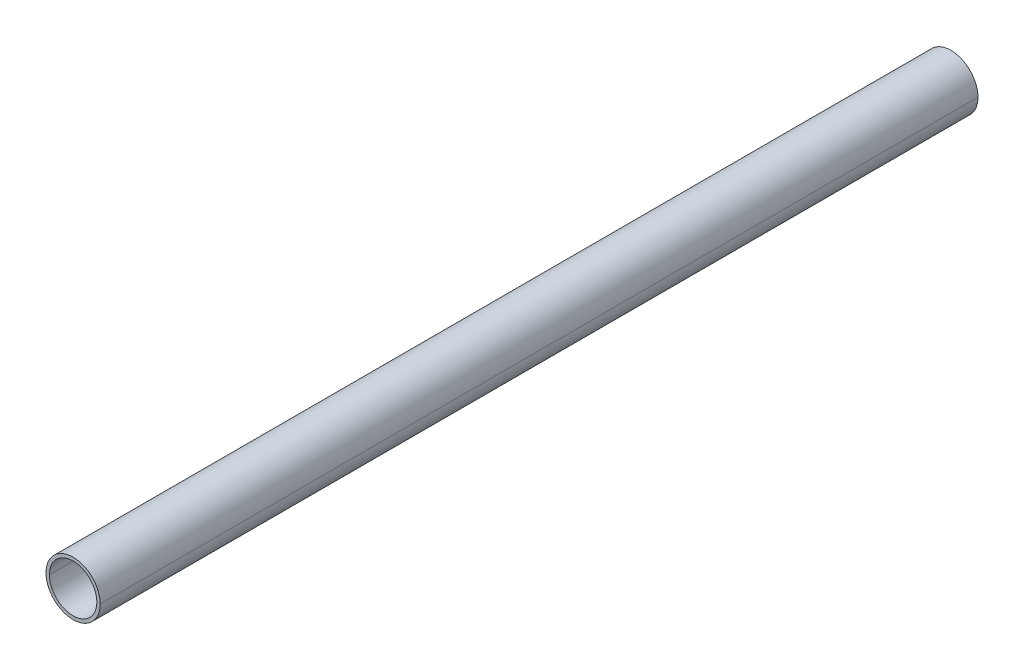
ISO-10303-21;
HEADER;
FILE_DESCRIPTION(('STEP AP214'),'2;1');
FILE_NAME('part.step','',(''),(''),'','','');
FILE_SCHEMA(('AUTOMOTIVE_DESIGN { 1 0 10303 214 1 1 1 1 }'));
ENDSEC;
DATA;
#1=APPLICATION_CONTEXT('core data for automotive mechanical design processes');
#2=APPLICATION_PROTOCOL_DEFINITION('international standard','automotive_design',2000,#1);
#3=PRODUCT_CONTEXT('',#1,'mechanical');
#4=PRODUCT('Part','Part','',(#3));
#5=PRODUCT_RELATED_PRODUCT_CATEGORY('part','',(#4));
#6=PRODUCT_DEFINITION_FORMATION('','',#4);
#7=PRODUCT_DEFINITION_CONTEXT('part definition',#1,'design');
#8=PRODUCT_DEFINITION('design','',#6,#7);
#9=PRODUCT_DEFINITION_SHAPE('','',#8);
#10=(LENGTH_UNIT() NAMED_UNIT(*) SI_UNIT(.MILLI.,.METRE.));
#11=(NAMED_UNIT(*) PLANE_ANGLE_UNIT() SI_UNIT($,.RADIAN.));
#12=(NAMED_UNIT(*) SI_UNIT($,.STERADIAN.) SOLID_ANGLE_UNIT());
#13=UNCERTAINTY_MEASURE_WITH_UNIT(LENGTH_MEASURE(1.E-05),#10,'distance_accuracy_value','');
#14=(GEOMETRIC_REPRESENTATION_CONTEXT(3) GLOBAL_UNCERTAINTY_ASSIGNED_CONTEXT((#13)) GLOBAL_UNIT_ASSIGNED_CONTEXT((#10,
#11,#12)) REPRESENTATION_CONTEXT('',''));
#15=CARTESIAN_POINT('',(0.,0.,0.));
#16=DIRECTION('',(0.,0.,1.));
#17=DIRECTION('',(1.,0.,0.));
#18=AXIS2_PLACEMENT_3D('',#15,#16,#17);
#19=CARTESIAN_POINT('',(0.,0.,405.));
#20=DIRECTION('',(0.,0.,-1.));
#21=DIRECTION('',(-1.,0.,0.));
#22=AXIS2_PLACEMENT_3D('',#19,#20,#21);
#23=CYLINDRICAL_SURFACE('',#22,10.95);
#24=DIRECTION('',(0.,0.,-1.));
#25=VECTOR('',#24,1.);
#26=CARTESIAN_POINT('',(10.95,0.,405.));
#27=LINE('',#26,#25);
#28=CARTESIAN_POINT('',(10.95,0.,405.));
#29=VERTEX_POINT('',#28);
#30=CARTESIAN_POINT('',(10.95,0.,0.));
#31=VERTEX_POINT('',#30);
#32=EDGE_CURVE('E83',#29,#31,#27,.T.);
#33=ORIENTED_EDGE('',*,*,#32,.F.);
#34=CARTESIAN_POINT('',(0.,0.,405.));
#35=DIRECTION('',(0.,0.,1.));
#36=DIRECTION('',(1.,0.,0.));
#37=AXIS2_PLACEMENT_3D('',#34,#35,#36);
#38=CIRCLE('',#37,10.95);
#39=CARTESIAN_POINT('',(-10.95,0.,405.));
#40=VERTEX_POINT('',#39);
#41=EDGE_CURVE('E68',#29,#40,#38,.T.);
#42=ORIENTED_EDGE('',*,*,#41,.T.);
#43=DIRECTION('',(0.,0.,-1.));
#44=VECTOR('',#43,1.);
#45=CARTESIAN_POINT('',(-10.95,0.,405.));
#46=LINE('',#45,#44);
#47=CARTESIAN_POINT('',(-10.95,0.,0.));
#48=VERTEX_POINT('',#47);
#49=EDGE_CURVE('E90',#40,#48,#46,.T.);
#50=ORIENTED_EDGE('',*,*,#49,.T.);
#51=CARTESIAN_POINT('',(0.,0.,0.));
#52=DIRECTION('',(0.,0.,1.));
#53=DIRECTION('',(1.,0.,0.));
#54=AXIS2_PLACEMENT_3D('',#51,#52,#53);
#55=CIRCLE('',#54,10.95);
#56=EDGE_CURVE('E11',#31,#48,#55,.T.);
#57=ORIENTED_EDGE('',*,*,#56,.F.);
#58=EDGE_LOOP('',(#33,#42,#50,#57));
#59=FACE_BOUND('',#58,.T.);
#60=ADVANCED_FACE('F16',(#59),#23,.F.);
#61=CARTESIAN_POINT('',(0.,0.,405.));
#62=DIRECTION('',(0.,0.,-1.));
#63=DIRECTION('',(-1.,0.,0.));
#64=AXIS2_PLACEMENT_3D('',#61,#62,#63);
#65=CYLINDRICAL_SURFACE('',#64,12.5);
#66=DIRECTION('',(0.,0.,-1.));
#67=VECTOR('',#66,1.);
#68=CARTESIAN_POINT('',(12.5,0.,405.));
#69=LINE('',#68,#67);
#70=CARTESIAN_POINT('',(12.5,0.,405.));
#71=VERTEX_POINT('',#70);
#72=CARTESIAN_POINT('',(12.5,0.,0.));
#73=VERTEX_POINT('',#72);
#74=EDGE_CURVE('E99',#71,#73,#69,.T.);
#75=ORIENTED_EDGE('',*,*,#74,.F.);
#76=CARTESIAN_POINT('',(0.,0.,405.));
#77=DIRECTION('',(0.,0.,1.));
#78=DIRECTION('',(1.,0.,0.));
#79=AXIS2_PLACEMENT_3D('',#76,#77,#78);
#80=CIRCLE('',#79,12.5);
#81=CARTESIAN_POINT('',(-12.5,0.,405.));
#82=VERTEX_POINT('',#81);
#83=EDGE_CURVE('E80',#82,#71,#80,.T.);
#84=ORIENTED_EDGE('',*,*,#83,.F.);
#85=DIRECTION('',(0.,0.,-1.));
#86=VECTOR('',#85,1.);
#87=CARTESIAN_POINT('',(-12.5,0.,405.));
#88=LINE('',#87,#86);
#89=CARTESIAN_POINT('',(-12.5,0.,0.));
#90=VERTEX_POINT('',#89);
#91=EDGE_CURVE('E20',#82,#90,#88,.T.);
#92=ORIENTED_EDGE('',*,*,#91,.T.);
#93=CARTESIAN_POINT('',(0.,0.,0.));
#94=DIRECTION('',(0.,0.,1.));
#95=DIRECTION('',(1.,0.,0.));
#96=AXIS2_PLACEMENT_3D('',#93,#94,#95);
#97=CIRCLE('',#96,12.5);
#98=EDGE_CURVE('E27',#90,#73,#97,.T.);
#99=ORIENTED_EDGE('',*,*,#98,.T.);
#100=EDGE_LOOP('',(#75,#84,#92,#99));
#101=FACE_BOUND('',#100,.T.);
#102=ADVANCED_FACE('F126',(#101),#65,.T.);
#103=CARTESIAN_POINT('',(0.,0.,0.));
#104=DIRECTION('',(0.,0.,1.));
#105=DIRECTION('',(1.,0.,0.));
#106=AXIS2_PLACEMENT_3D('',#103,#104,#105);
#107=PLANE('',#106);
#108=CARTESIAN_POINT('',(0.,0.,0.));
#109=DIRECTION('',(0.,0.,1.));
#110=DIRECTION('',(1.,0.,0.));
#111=AXIS2_PLACEMENT_3D('',#108,#109,#110);
#112=CIRCLE('',#111,10.95);
#113=EDGE_CURVE('E88',#48,#31,#112,.T.);
#114=ORIENTED_EDGE('',*,*,#113,.T.);
#115=ORIENTED_EDGE('',*,*,#56,.T.);
#116=EDGE_LOOP('',(#114,#115));
#117=FACE_BOUND('',#116,.T.);
#118=ORIENTED_EDGE('',*,*,#98,.F.);
#119=CARTESIAN_POINT('',(0.,0.,0.));
#120=DIRECTION('',(0.,0.,1.));
#121=DIRECTION('',(1.,0.,0.));
#122=AXIS2_PLACEMENT_3D('',#119,#120,#121);
#123=CIRCLE('',#122,12.5);
#124=EDGE_CURVE('E102',#73,#90,#123,.T.);
#125=ORIENTED_EDGE('',*,*,#124,.F.);
#126=EDGE_LOOP('',(#118,#125));
#127=FACE_BOUND('',#126,.T.);
#128=ADVANCED_FACE('F134',(#117,#127),#107,.F.);
#129=CARTESIAN_POINT('',(0.,0.,405.));
#130=DIRECTION('',(0.,0.,1.));
#131=DIRECTION('',(1.,0.,0.));
#132=AXIS2_PLACEMENT_3D('',#129,#130,#131);
#133=PLANE('',#132);
#134=CARTESIAN_POINT('',(0.,0.,405.));
#135=DIRECTION('',(0.,0.,1.));
#136=DIRECTION('',(1.,0.,0.));
#137=AXIS2_PLACEMENT_3D('',#134,#135,#136);
#138=CIRCLE('',#137,10.95);
#139=EDGE_CURVE('E78',#40,#29,#138,.T.);
#140=ORIENTED_EDGE('',*,*,#139,.F.);
#141=ORIENTED_EDGE('',*,*,#41,.F.);
#142=EDGE_LOOP('',(#140,#141));
#143=FACE_BOUND('',#142,.T.);
#144=ORIENTED_EDGE('',*,*,#83,.T.);
#145=CARTESIAN_POINT('',(0.,0.,405.));
#146=DIRECTION('',(0.,0.,1.));
#147=DIRECTION('',(1.,0.,0.));
#148=AXIS2_PLACEMENT_3D('',#145,#146,#147);
#149=CIRCLE('',#148,12.5);
#150=EDGE_CURVE('E103',#71,#82,#149,.T.);
#151=ORIENTED_EDGE('',*,*,#150,.T.);
#152=EDGE_LOOP('',(#144,#151));
#153=FACE_BOUND('',#152,.T.);
#154=ADVANCED_FACE('F75',(#143,#153),#133,.T.);
#155=CARTESIAN_POINT('',(0.,0.,405.));
#156=DIRECTION('',(0.,0.,-1.));
#157=DIRECTION('',(-1.,0.,0.));
#158=AXIS2_PLACEMENT_3D('',#155,#156,#157);
#159=CYLINDRICAL_SURFACE('',#158,12.5);
#160=ORIENTED_EDGE('',*,*,#150,.F.);
#161=ORIENTED_EDGE('',*,*,#74,.T.);
#162=ORIENTED_EDGE('',*,*,#124,.T.);
#163=ORIENTED_EDGE('',*,*,#91,.F.);
#164=EDGE_LOOP('',(#160,#161,#162,#163));
#165=FACE_BOUND('',#164,.T.);
#166=ADVANCED_FACE('F127',(#165),#159,.T.);
#167=CARTESIAN_POINT('',(0.,0.,405.));
#168=DIRECTION('',(0.,0.,-1.));
#169=DIRECTION('',(-1.,0.,0.));
#170=AXIS2_PLACEMENT_3D('',#167,#168,#169);
#171=CYLINDRICAL_SURFACE('',#170,10.95);
#172=ORIENTED_EDGE('',*,*,#139,.T.);
#173=ORIENTED_EDGE('',*,*,#32,.T.);
#174=ORIENTED_EDGE('',*,*,#113,.F.);
#175=ORIENTED_EDGE('',*,*,#49,.F.);
#176=EDGE_LOOP('',(#172,#173,#174,#175));
#177=FACE_BOUND('',#176,.T.);
#178=ADVANCED_FACE('F18',(#177),#171,.F.);
#179=CLOSED_SHELL('',(#60,#102,#128,#154,#166,#178));
#180=MANIFOLD_SOLID_BREP('B1',#179);
#181=ADVANCED_BREP_SHAPE_REPRESENTATION('',(#18,#180),#14);
#182=SHAPE_DEFINITION_REPRESENTATION(#9,#181);
ENDSEC;
END-ISO-10303-21;
